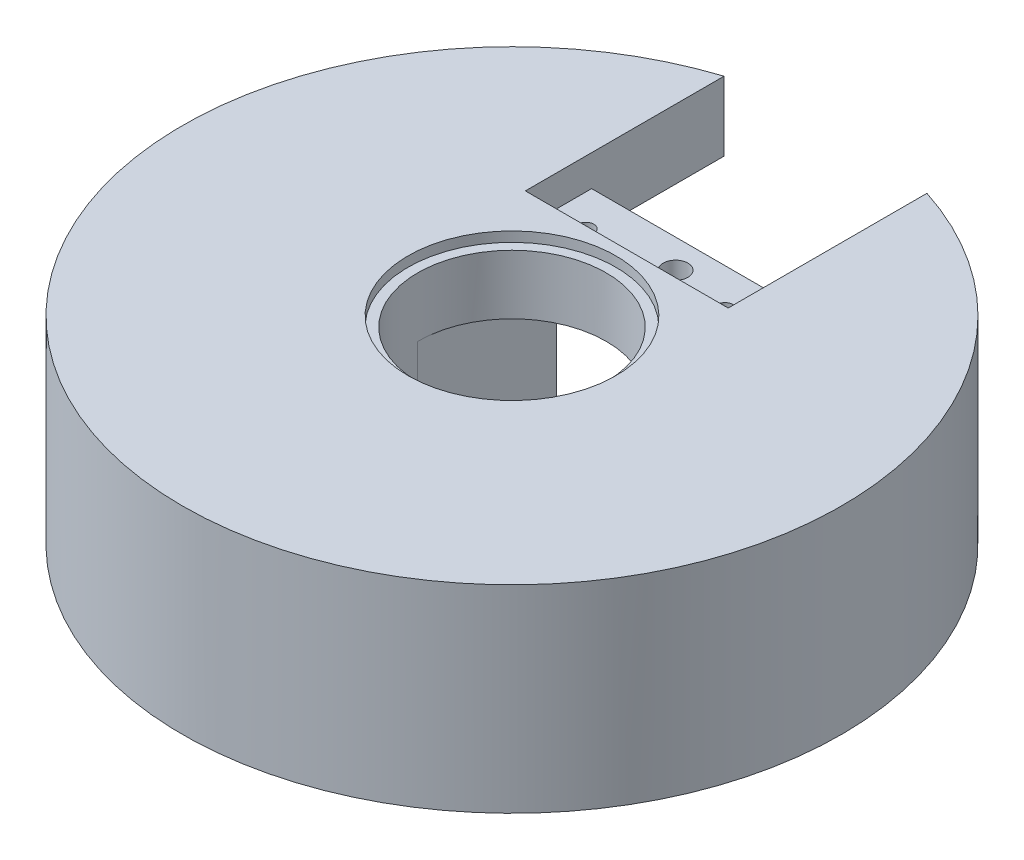
ISO-10303-21;
HEADER;
FILE_DESCRIPTION(('STEP AP214'),'2;1');
FILE_NAME('part.step','',(''),(''),'','','');
FILE_SCHEMA(('AUTOMOTIVE_DESIGN { 1 0 10303 214 1 1 1 1 }'));
ENDSEC;
DATA;
#1=APPLICATION_CONTEXT('core data for automotive mechanical design processes');
#2=APPLICATION_PROTOCOL_DEFINITION('international standard','automotive_design',2000,#1);
#3=PRODUCT_CONTEXT('',#1,'mechanical');
#4=PRODUCT('Part','Part','',(#3));
#5=PRODUCT_RELATED_PRODUCT_CATEGORY('part','',(#4));
#6=PRODUCT_DEFINITION_FORMATION('','',#4);
#7=PRODUCT_DEFINITION_CONTEXT('part definition',#1,'design');
#8=PRODUCT_DEFINITION('design','',#6,#7);
#9=PRODUCT_DEFINITION_SHAPE('','',#8);
#10=(LENGTH_UNIT() NAMED_UNIT(*) SI_UNIT(.MILLI.,.METRE.));
#11=(NAMED_UNIT(*) PLANE_ANGLE_UNIT() SI_UNIT($,.RADIAN.));
#12=(NAMED_UNIT(*) SI_UNIT($,.STERADIAN.) SOLID_ANGLE_UNIT());
#13=UNCERTAINTY_MEASURE_WITH_UNIT(LENGTH_MEASURE(1.E-05),#10,'distance_accuracy_value','');
#14=(GEOMETRIC_REPRESENTATION_CONTEXT(3) GLOBAL_UNCERTAINTY_ASSIGNED_CONTEXT((#13)) GLOBAL_UNIT_ASSIGNED_CONTEXT((#10,
#11,#12)) REPRESENTATION_CONTEXT('',''));
#15=CARTESIAN_POINT('',(0.,0.,0.));
#16=DIRECTION('',(0.,0.,1.));
#17=DIRECTION('',(1.,0.,0.));
#18=AXIS2_PLACEMENT_3D('',#15,#16,#17);
#19=CARTESIAN_POINT('',(0.,13.,0.));
#20=DIRECTION('',(0.,-1.,0.));
#21=DIRECTION('',(0.,0.,-1.));
#22=AXIS2_PLACEMENT_3D('',#19,#20,#21);
#23=CYLINDRICAL_SURFACE('',#22,9.525);
#24=CARTESIAN_POINT('',(0.,0.,0.));
#25=DIRECTION('',(0.,-1.,0.));
#26=DIRECTION('',(0.,0.,-1.));
#27=AXIS2_PLACEMENT_3D('',#24,#25,#26);
#28=CIRCLE('',#27,9.525);
#29=CARTESIAN_POINT('',(9.525,0.,0.));
#30=VERTEX_POINT('',#29);
#31=CARTESIAN_POINT('',(-9.525,0.,0.));
#32=VERTEX_POINT('',#31);
#33=EDGE_CURVE('E183',#30,#32,#28,.T.);
#34=ORIENTED_EDGE('',*,*,#33,.T.);
#35=DIRECTION('',(0.,-1.,0.));
#36=VECTOR('',#35,1.);
#37=CARTESIAN_POINT('',(-9.525,13.,0.));
#38=LINE('',#37,#36);
#39=CARTESIAN_POINT('',(-9.525,13.,0.));
#40=VERTEX_POINT('',#39);
#41=EDGE_CURVE('E214',#40,#32,#38,.T.);
#42=ORIENTED_EDGE('',*,*,#41,.F.);
#43=CARTESIAN_POINT('',(0.,13.,0.));
#44=DIRECTION('',(0.,-1.,0.));
#45=DIRECTION('',(0.,0.,-1.));
#46=AXIS2_PLACEMENT_3D('',#43,#44,#45);
#47=CIRCLE('',#46,9.525);
#48=CARTESIAN_POINT('',(9.525,13.,0.));
#49=VERTEX_POINT('',#48);
#50=EDGE_CURVE('E11',#40,#49,#47,.T.);
#51=ORIENTED_EDGE('',*,*,#50,.T.);
#52=DIRECTION('',(0.,-1.,0.));
#53=VECTOR('',#52,1.);
#54=CARTESIAN_POINT('',(9.525,13.,0.));
#55=LINE('',#54,#53);
#56=EDGE_CURVE('E174',#49,#30,#55,.T.);
#57=ORIENTED_EDGE('',*,*,#56,.T.);
#58=EDGE_LOOP('',(#34,#42,#51,#57));
#59=FACE_BOUND('',#58,.T.);
#60=CARTESIAN_POINT('',(0.,19.,0.));
#61=DIRECTION('',(0.,1.,0.));
#62=DIRECTION('',(0.,0.,1.));
#63=AXIS2_PLACEMENT_3D('',#60,#61,#62);
#64=CIRCLE('',#63,9.525);
#65=CARTESIAN_POINT('',(0.,19.,9.525));
#66=VERTEX_POINT('',#65);
#67=EDGE_CURVE('E253',#66,#66,#64,.T.);
#68=ORIENTED_EDGE('',*,*,#67,.T.);
#69=EDGE_LOOP('',(#68));
#70=FACE_BOUND('',#69,.T.);
#71=ADVANCED_FACE('F47',(#59,#70),#23,.F.);
#72=CARTESIAN_POINT('',(0.,20.,0.));
#73=DIRECTION('',(0.,-1.,0.));
#74=DIRECTION('',(0.,0.,-1.));
#75=AXIS2_PLACEMENT_3D('',#72,#73,#74);
#76=CYLINDRICAL_SURFACE('',#75,33.3);
#77=CARTESIAN_POINT('',(0.,13.,0.));
#78=DIRECTION('',(0.,-1.,0.));
#79=DIRECTION('',(0.,0.,-1.));
#80=AXIS2_PLACEMENT_3D('',#77,#78,#79);
#81=CIRCLE('',#80,33.3);
#82=CARTESIAN_POINT('',(10.25,13.,-31.6832368927166));
#83=VERTEX_POINT('',#82);
#84=CARTESIAN_POINT('',(21.202606521729,13.,-25.6776065217289));
#85=VERTEX_POINT('',#84);
#86=EDGE_CURVE('E168',#83,#85,#81,.T.);
#87=ORIENTED_EDGE('',*,*,#86,.F.);
#88=DIRECTION('',(0.,-1.,0.));
#89=VECTOR('',#88,1.);
#90=CARTESIAN_POINT('',(10.25,20.,-31.6832368927166));
#91=LINE('',#90,#89);
#92=CARTESIAN_POINT('',(10.25,20.,-31.6832368927166));
#93=VERTEX_POINT('',#92);
#94=EDGE_CURVE('E146',#83,#93,#91,.F.);
#95=ORIENTED_EDGE('',*,*,#94,.T.);
#96=CARTESIAN_POINT('',(0.,20.,0.));
#97=DIRECTION('',(0.,1.,0.));
#98=DIRECTION('',(0.,0.,1.));
#99=AXIS2_PLACEMENT_3D('',#96,#97,#98);
#100=CIRCLE('',#99,33.3);
#101=CARTESIAN_POINT('',(-10.25,20.,-31.6832368927166));
#102=VERTEX_POINT('',#101);
#103=EDGE_CURVE('E57',#102,#93,#100,.T.);
#104=ORIENTED_EDGE('',*,*,#103,.F.);
#105=DIRECTION('',(0.,-1.,0.));
#106=VECTOR('',#105,1.);
#107=CARTESIAN_POINT('',(-10.25,20.,-31.6832368927166));
#108=LINE('',#107,#106);
#109=CARTESIAN_POINT('',(-10.25,13.,-31.6832368927166));
#110=VERTEX_POINT('',#109);
#111=EDGE_CURVE('E73',#102,#110,#108,.T.);
#112=ORIENTED_EDGE('',*,*,#111,.T.);
#113=CARTESIAN_POINT('',(-21.202606521729,13.,-25.6776065217289));
#114=VERTEX_POINT('',#113);
#115=EDGE_CURVE('E142',#114,#110,#81,.T.);
#116=ORIENTED_EDGE('',*,*,#115,.F.);
#117=DIRECTION('',(0.,-1.,0.));
#118=VECTOR('',#117,1.);
#119=CARTESIAN_POINT('',(-21.202606521729,13.,-25.6776065217289));
#120=LINE('',#119,#118);
#121=CARTESIAN_POINT('',(-21.202606521729,0.,-25.6776065217289));
#122=VERTEX_POINT('',#121);
#123=EDGE_CURVE('E208',#114,#122,#120,.T.);
#124=ORIENTED_EDGE('',*,*,#123,.T.);
#125=CARTESIAN_POINT('',(0.,0.,0.));
#126=DIRECTION('',(0.,1.,0.));
#127=DIRECTION('',(0.,0.,1.));
#128=AXIS2_PLACEMENT_3D('',#125,#126,#127);
#129=CIRCLE('',#128,33.3);
#130=CARTESIAN_POINT('',(21.202606521729,0.,-25.6776065217289));
#131=VERTEX_POINT('',#130);
#132=EDGE_CURVE('E222',#122,#131,#129,.T.);
#133=ORIENTED_EDGE('',*,*,#132,.T.);
#134=DIRECTION('',(0.,-1.,0.));
#135=VECTOR('',#134,1.);
#136=CARTESIAN_POINT('',(21.202606521729,13.,-25.6776065217289));
#137=LINE('',#136,#135);
#138=EDGE_CURVE('E205',#85,#131,#137,.T.);
#139=ORIENTED_EDGE('',*,*,#138,.F.);
#140=EDGE_LOOP('',(#87,#95,#104,#112,#116,#124,#133,#139));
#141=FACE_BOUND('',#140,.T.);
#142=ADVANCED_FACE('F49',(#141),#76,.T.);
#143=CARTESIAN_POINT('',(0.,0.,0.));
#144=DIRECTION('',(0.,1.,0.));
#145=DIRECTION('',(0.,0.,1.));
#146=AXIS2_PLACEMENT_3D('',#143,#144,#145);
#147=PLANE('',#146);
#148=CARTESIAN_POINT('',(0.,0.,18.));
#149=DIRECTION('',(0.,1.,0.));
#150=DIRECTION('',(0.,0.,1.));
#151=AXIS2_PLACEMENT_3D('',#148,#149,#150);
#152=CIRCLE('',#151,2.5019);
#153=CARTESIAN_POINT('',(0.,0.,20.5019));
#154=VERTEX_POINT('',#153);
#155=EDGE_CURVE('E226',#154,#154,#152,.F.);
#156=ORIENTED_EDGE('',*,*,#155,.F.);
#157=EDGE_LOOP('',(#156));
#158=FACE_BOUND('',#157,.T.);
#159=CARTESIAN_POINT('',(15.5884572681199,0.,-9.00000000000007));
#160=DIRECTION('',(0.,1.,0.));
#161=DIRECTION('',(0.,0.,1.));
#162=AXIS2_PLACEMENT_3D('',#159,#160,#161);
#163=CIRCLE('',#162,2.5019);
#164=CARTESIAN_POINT('',(15.5884572681199,0.,-6.49810000000007));
#165=VERTEX_POINT('',#164);
#166=EDGE_CURVE('E230',#165,#165,#163,.F.);
#167=ORIENTED_EDGE('',*,*,#166,.F.);
#168=EDGE_LOOP('',(#167));
#169=FACE_BOUND('',#168,.T.);
#170=CARTESIAN_POINT('',(-15.58845726812,0.,-8.99999999999985));
#171=DIRECTION('',(0.,1.,0.));
#172=DIRECTION('',(0.,0.,1.));
#173=AXIS2_PLACEMENT_3D('',#170,#171,#172);
#174=CIRCLE('',#173,2.5019);
#175=CARTESIAN_POINT('',(-15.58845726812,0.,-6.49809999999985));
#176=VERTEX_POINT('',#175);
#177=EDGE_CURVE('E204',#176,#176,#174,.F.);
#178=ORIENTED_EDGE('',*,*,#177,.F.);
#179=EDGE_LOOP('',(#178));
#180=FACE_BOUND('',#179,.T.);
#181=DIRECTION('',(0.707106781186549,0.,-0.707106781186546));
#182=VECTOR('',#181,1.);
#183=CARTESIAN_POINT('',(-2.23750000000002,0.,-2.23750000000002));
#184=LINE('',#183,#182);
#185=CARTESIAN_POINT('',(9.525,0.,-14.));
#186=VERTEX_POINT('',#185);
#187=EDGE_CURVE('E195',#186,#131,#184,.T.);
#188=ORIENTED_EDGE('',*,*,#187,.T.);
#189=ORIENTED_EDGE('',*,*,#132,.F.);
#190=DIRECTION('',(-0.707106781186549,0.,-0.707106781186546));
#191=VECTOR('',#190,1.);
#192=CARTESIAN_POINT('',(2.23750000000002,0.,-2.23750000000002));
#193=LINE('',#192,#191);
#194=CARTESIAN_POINT('',(-9.525,0.,-14.));
#195=VERTEX_POINT('',#194);
#196=EDGE_CURVE('E192',#195,#122,#193,.T.);
#197=ORIENTED_EDGE('',*,*,#196,.F.);
#198=DIRECTION('',(0.,0.,-1.));
#199=VECTOR('',#198,1.);
#200=CARTESIAN_POINT('',(-9.525,0.,0.));
#201=LINE('',#200,#199);
#202=EDGE_CURVE('E188',#32,#195,#201,.T.);
#203=ORIENTED_EDGE('',*,*,#202,.F.);
#204=ORIENTED_EDGE('',*,*,#33,.F.);
#205=DIRECTION('',(0.,0.,-1.));
#206=VECTOR('',#205,1.);
#207=CARTESIAN_POINT('',(9.525,0.,0.));
#208=LINE('',#207,#206);
#209=EDGE_CURVE('E179',#30,#186,#208,.T.);
#210=ORIENTED_EDGE('',*,*,#209,.T.);
#211=EDGE_LOOP('',(#188,#189,#197,#203,#204,#210));
#212=FACE_BOUND('',#211,.T.);
#213=ADVANCED_FACE('F453',(#158,#169,#180,#212),#147,.F.);
#214=CARTESIAN_POINT('',(0.,20.,0.));
#215=DIRECTION('',(0.,1.,0.));
#216=DIRECTION('',(0.,0.,1.));
#217=AXIS2_PLACEMENT_3D('',#214,#215,#216);
#218=PLANE('',#217);
#219=DIRECTION('',(0.,0.,-1.));
#220=VECTOR('',#219,1.);
#221=CARTESIAN_POINT('',(10.25,20.,-11.6));
#222=LINE('',#221,#220);
#223=CARTESIAN_POINT('',(10.25,20.,-11.6));
#224=VERTEX_POINT('',#223);
#225=EDGE_CURVE('E156',#224,#93,#222,.T.);
#226=ORIENTED_EDGE('',*,*,#225,.F.);
#227=DIRECTION('',(1.,0.,0.));
#228=VECTOR('',#227,1.);
#229=CARTESIAN_POINT('',(-10.25,20.,-11.6));
#230=LINE('',#229,#228);
#231=CARTESIAN_POINT('',(-10.25,20.,-11.6));
#232=VERTEX_POINT('',#231);
#233=EDGE_CURVE('E375',#232,#224,#230,.T.);
#234=ORIENTED_EDGE('',*,*,#233,.F.);
#235=DIRECTION('',(0.,0.,1.));
#236=VECTOR('',#235,1.);
#237=CARTESIAN_POINT('',(-10.25,20.,-11.6));
#238=LINE('',#237,#236);
#239=EDGE_CURVE('E381',#102,#232,#238,.T.);
#240=ORIENTED_EDGE('',*,*,#239,.F.);
#241=ORIENTED_EDGE('',*,*,#103,.T.);
#242=EDGE_LOOP('',(#226,#234,#240,#241));
#243=FACE_BOUND('',#242,.T.);
#244=CARTESIAN_POINT('',(0.,20.,0.));
#245=DIRECTION('',(0.,1.,0.));
#246=DIRECTION('',(0.,0.,1.));
#247=AXIS2_PLACEMENT_3D('',#244,#245,#246);
#248=CIRCLE('',#247,10.5);
#249=CARTESIAN_POINT('',(0.,20.,10.5));
#250=VERTEX_POINT('',#249);
#251=EDGE_CURVE('E247',#250,#250,#248,.T.);
#252=ORIENTED_EDGE('',*,*,#251,.F.);
#253=EDGE_LOOP('',(#252));
#254=FACE_BOUND('',#253,.T.);
#255=ADVANCED_FACE('F423',(#243,#254),#218,.T.);
#256=CARTESIAN_POINT('',(0.,0.,18.));
#257=DIRECTION('',(1.,0.,0.));
#258=DIRECTION('',(0.,0.,-1.));
#259=AXIS2_PLACEMENT_3D('',#256,#257,#258);
#260=SPHERICAL_SURFACE('',#259,2.5019);
#261=CARTESIAN_POINT('',(0.,0.,18.));
#262=DIRECTION('',(0.,1.,0.));
#263=DIRECTION('',(0.,0.,1.));
#264=AXIS2_PLACEMENT_3D('',#261,#262,#263);
#265=SPHERICAL_SURFACE('',#264,2.5019);
#266=ORIENTED_EDGE('',*,*,#155,.T.);
#267=EDGE_LOOP('',(#266));
#268=FACE_BOUND('',#267,.T.);
#269=ADVANCED_FACE('F471',(#268),#265,.F.);
#270=CARTESIAN_POINT('',(15.5884572681199,0.,-9.00000000000007));
#271=DIRECTION('',(-0.500000000000004,0.,-0.866025403784436));
#272=DIRECTION('',(-0.866025403784436,0.,0.500000000000004));
#273=AXIS2_PLACEMENT_3D('',#270,#271,#272);
#274=SPHERICAL_SURFACE('',#273,2.5019);
#275=CARTESIAN_POINT('',(15.5884572681199,0.,-9.00000000000007));
#276=DIRECTION('',(0.,1.,0.));
#277=DIRECTION('',(0.,0.,1.));
#278=AXIS2_PLACEMENT_3D('',#275,#276,#277);
#279=SPHERICAL_SURFACE('',#278,2.5019);
#280=ORIENTED_EDGE('',*,*,#166,.T.);
#281=EDGE_LOOP('',(#280));
#282=FACE_BOUND('',#281,.T.);
#283=ADVANCED_FACE('F467',(#282),#279,.F.);
#284=CARTESIAN_POINT('',(-15.58845726812,0.,-8.99999999999985));
#285=DIRECTION('',(-0.499999999999992,0.,0.866025403784443));
#286=DIRECTION('',(0.866025403784443,0.,0.499999999999992));
#287=AXIS2_PLACEMENT_3D('',#284,#285,#286);
#288=SPHERICAL_SURFACE('',#287,2.5019);
#289=CARTESIAN_POINT('',(-15.58845726812,0.,-8.99999999999985));
#290=DIRECTION('',(0.,1.,0.));
#291=DIRECTION('',(0.,0.,1.));
#292=AXIS2_PLACEMENT_3D('',#289,#290,#291);
#293=SPHERICAL_SURFACE('',#292,2.5019);
#294=ORIENTED_EDGE('',*,*,#177,.T.);
#295=EDGE_LOOP('',(#294));
#296=FACE_BOUND('',#295,.T.);
#297=ADVANCED_FACE('F463',(#296),#293,.F.);
#298=CARTESIAN_POINT('',(9.525,13.,0.));
#299=DIRECTION('',(-1.,0.,0.));
#300=DIRECTION('',(0.,0.,1.));
#301=AXIS2_PLACEMENT_3D('',#298,#299,#300);
#302=PLANE('',#301);
#303=ORIENTED_EDGE('',*,*,#209,.F.);
#304=ORIENTED_EDGE('',*,*,#56,.F.);
#305=DIRECTION('',(0.,0.,-1.));
#306=VECTOR('',#305,1.);
#307=CARTESIAN_POINT('',(9.525,13.,0.));
#308=LINE('',#307,#306);
#309=CARTESIAN_POINT('',(9.525,13.,-14.));
#310=VERTEX_POINT('',#309);
#311=EDGE_CURVE('E199',#49,#310,#308,.T.);
#312=ORIENTED_EDGE('',*,*,#311,.T.);
#313=DIRECTION('',(0.,-1.,0.));
#314=VECTOR('',#313,1.);
#315=CARTESIAN_POINT('',(9.525,13.,-14.));
#316=LINE('',#315,#314);
#317=EDGE_CURVE('E200',#310,#186,#316,.T.);
#318=ORIENTED_EDGE('',*,*,#317,.T.);
#319=EDGE_LOOP('',(#303,#304,#312,#318));
#320=FACE_BOUND('',#319,.T.);
#321=ADVANCED_FACE('F459',(#320),#302,.T.);
#322=CARTESIAN_POINT('',(-2.23750000000002,13.,-2.23750000000002));
#323=DIRECTION('',(-0.707106781186546,0.,-0.707106781186548));
#324=DIRECTION('',(-0.707106781186549,0.,0.707106781186547));
#325=AXIS2_PLACEMENT_3D('',#322,#323,#324);
#326=PLANE('',#325);
#327=ORIENTED_EDGE('',*,*,#187,.F.);
#328=ORIENTED_EDGE('',*,*,#317,.F.);
#329=DIRECTION('',(0.707106781186549,0.,-0.707106781186546));
#330=VECTOR('',#329,1.);
#331=CARTESIAN_POINT('',(-2.23750000000002,13.,-2.23750000000002));
#332=LINE('',#331,#330);
#333=EDGE_CURVE('E167',#310,#85,#332,.T.);
#334=ORIENTED_EDGE('',*,*,#333,.T.);
#335=ORIENTED_EDGE('',*,*,#138,.T.);
#336=EDGE_LOOP('',(#327,#328,#334,#335));
#337=FACE_BOUND('',#336,.T.);
#338=ADVANCED_FACE('F462',(#337),#326,.T.);
#339=CARTESIAN_POINT('',(2.23750000000002,13.,-2.23750000000002));
#340=DIRECTION('',(-0.707106781186546,0.,0.707106781186548));
#341=DIRECTION('',(0.707106781186549,0.,0.707106781186547));
#342=AXIS2_PLACEMENT_3D('',#339,#340,#341);
#343=PLANE('',#342);
#344=ORIENTED_EDGE('',*,*,#196,.T.);
#345=ORIENTED_EDGE('',*,*,#123,.F.);
#346=DIRECTION('',(-0.707106781186549,0.,-0.707106781186546));
#347=VECTOR('',#346,1.);
#348=CARTESIAN_POINT('',(2.23750000000002,13.,-2.23750000000002));
#349=LINE('',#348,#347);
#350=CARTESIAN_POINT('',(-9.525,13.,-14.));
#351=VERTEX_POINT('',#350);
#352=EDGE_CURVE('E165',#351,#114,#349,.T.);
#353=ORIENTED_EDGE('',*,*,#352,.F.);
#354=DIRECTION('',(0.,-1.,0.));
#355=VECTOR('',#354,1.);
#356=CARTESIAN_POINT('',(-9.525,13.,-14.));
#357=LINE('',#356,#355);
#358=EDGE_CURVE('E211',#351,#195,#357,.T.);
#359=ORIENTED_EDGE('',*,*,#358,.T.);
#360=EDGE_LOOP('',(#344,#345,#353,#359));
#361=FACE_BOUND('',#360,.T.);
#362=ADVANCED_FACE('F494',(#361),#343,.F.);
#363=CARTESIAN_POINT('',(-9.525,13.,0.));
#364=DIRECTION('',(-1.,0.,0.));
#365=DIRECTION('',(0.,0.,1.));
#366=AXIS2_PLACEMENT_3D('',#363,#364,#365);
#367=PLANE('',#366);
#368=ORIENTED_EDGE('',*,*,#202,.T.);
#369=ORIENTED_EDGE('',*,*,#358,.F.);
#370=DIRECTION('',(0.,0.,-1.));
#371=VECTOR('',#370,1.);
#372=CARTESIAN_POINT('',(-9.525,13.,0.));
#373=LINE('',#372,#371);
#374=EDGE_CURVE('E265',#40,#351,#373,.T.);
#375=ORIENTED_EDGE('',*,*,#374,.F.);
#376=ORIENTED_EDGE('',*,*,#41,.T.);
#377=EDGE_LOOP('',(#368,#369,#375,#376));
#378=FACE_BOUND('',#377,.T.);
#379=ADVANCED_FACE('F457',(#378),#367,.F.);
#380=CARTESIAN_POINT('',(0.,13.,0.));
#381=DIRECTION('',(0.,-1.,0.));
#382=DIRECTION('',(0.,0.,-1.));
#383=AXIS2_PLACEMENT_3D('',#380,#381,#382);
#384=PLANE('',#383);
#385=DIRECTION('',(0.,0.,-1.));
#386=VECTOR('',#385,1.);
#387=CARTESIAN_POINT('',(10.25,13.,-18.3));
#388=LINE('',#387,#386);
#389=CARTESIAN_POINT('',(10.25,13.,-18.3));
#390=VERTEX_POINT('',#389);
#391=EDGE_CURVE('E405',#390,#83,#388,.T.);
#392=ORIENTED_EDGE('',*,*,#391,.T.);
#393=ORIENTED_EDGE('',*,*,#86,.T.);
#394=ORIENTED_EDGE('',*,*,#333,.F.);
#395=ORIENTED_EDGE('',*,*,#311,.F.);
#396=ORIENTED_EDGE('',*,*,#50,.F.);
#397=ORIENTED_EDGE('',*,*,#374,.T.);
#398=ORIENTED_EDGE('',*,*,#352,.T.);
#399=ORIENTED_EDGE('',*,*,#115,.T.);
#400=DIRECTION('',(0.,0.,1.));
#401=VECTOR('',#400,1.);
#402=CARTESIAN_POINT('',(-10.25,13.,-18.3));
#403=LINE('',#402,#401);
#404=CARTESIAN_POINT('',(-10.25,13.,-18.3));
#405=VERTEX_POINT('',#404);
#406=EDGE_CURVE('E150',#110,#405,#403,.T.);
#407=ORIENTED_EDGE('',*,*,#406,.T.);
#408=DIRECTION('',(1.,0.,0.));
#409=VECTOR('',#408,1.);
#410=CARTESIAN_POINT('',(-10.25,13.,-18.3));
#411=LINE('',#410,#409);
#412=EDGE_CURVE('E410',#405,#390,#411,.T.);
#413=ORIENTED_EDGE('',*,*,#412,.T.);
#414=EDGE_LOOP('',(#392,#393,#394,#395,#396,#397,#398,#399,#407,#413));
#415=FACE_BOUND('',#414,.T.);
#416=CARTESIAN_POINT('',(-7.03,13.,-14.5));
#417=DIRECTION('',(0.,-1.,0.));
#418=DIRECTION('',(0.,0.,-1.));
#419=AXIS2_PLACEMENT_3D('',#416,#417,#418);
#420=CIRCLE('',#419,0.8);
#421=CARTESIAN_POINT('',(-7.03,13.,-15.3));
#422=VERTEX_POINT('',#421);
#423=EDGE_CURVE('E244',#422,#422,#420,.T.);
#424=ORIENTED_EDGE('',*,*,#423,.F.);
#425=EDGE_LOOP('',(#424));
#426=FACE_BOUND('',#425,.T.);
#427=CARTESIAN_POINT('',(7.03,13.,-14.5));
#428=DIRECTION('',(0.,-1.,0.));
#429=DIRECTION('',(0.,0.,-1.));
#430=AXIS2_PLACEMENT_3D('',#427,#428,#429);
#431=CIRCLE('',#430,0.8);
#432=CARTESIAN_POINT('',(7.03,13.,-15.3));
#433=VERTEX_POINT('',#432);
#434=EDGE_CURVE('E241',#433,#433,#431,.T.);
#435=ORIENTED_EDGE('',*,*,#434,.F.);
#436=EDGE_LOOP('',(#435));
#437=FACE_BOUND('',#436,.T.);
#438=CARTESIAN_POINT('',(1.13,13.,-15.4));
#439=DIRECTION('',(0.,-1.,0.));
#440=DIRECTION('',(0.,0.,-1.));
#441=AXIS2_PLACEMENT_3D('',#438,#439,#440);
#442=CIRCLE('',#441,1.25);
#443=CARTESIAN_POINT('',(1.13,13.,-16.65));
#444=VERTEX_POINT('',#443);
#445=EDGE_CURVE('E237',#444,#444,#442,.T.);
#446=ORIENTED_EDGE('',*,*,#445,.F.);
#447=EDGE_LOOP('',(#446));
#448=FACE_BOUND('',#447,.T.);
#449=ADVANCED_FACE('F161',(#415,#426,#437,#448),#384,.T.);
#450=CARTESIAN_POINT('',(0.,19.,0.));
#451=DIRECTION('',(0.,1.,0.));
#452=DIRECTION('',(0.,0.,1.));
#453=AXIS2_PLACEMENT_3D('',#450,#451,#452);
#454=CYLINDRICAL_SURFACE('',#453,10.5);
#455=CARTESIAN_POINT('',(0.,19.,0.));
#456=DIRECTION('',(0.,1.,0.));
#457=DIRECTION('',(0.,0.,1.));
#458=AXIS2_PLACEMENT_3D('',#455,#456,#457);
#459=CIRCLE('',#458,10.5);
#460=CARTESIAN_POINT('',(0.,19.,10.5));
#461=VERTEX_POINT('',#460);
#462=EDGE_CURVE('E184',#461,#461,#459,.T.);
#463=ORIENTED_EDGE('',*,*,#462,.F.);
#464=EDGE_LOOP('',(#463));
#465=FACE_BOUND('',#464,.T.);
#466=ORIENTED_EDGE('',*,*,#251,.T.);
#467=EDGE_LOOP('',(#466));
#468=FACE_BOUND('',#467,.T.);
#469=ADVANCED_FACE('F507',(#465,#468),#454,.F.);
#470=CARTESIAN_POINT('',(0.,19.,0.));
#471=DIRECTION('',(0.,1.,0.));
#472=DIRECTION('',(0.,0.,1.));
#473=AXIS2_PLACEMENT_3D('',#470,#471,#472);
#474=PLANE('',#473);
#475=ORIENTED_EDGE('',*,*,#67,.F.);
#476=EDGE_LOOP('',(#475));
#477=FACE_BOUND('',#476,.T.);
#478=ORIENTED_EDGE('',*,*,#462,.T.);
#479=EDGE_LOOP('',(#478));
#480=FACE_BOUND('',#479,.T.);
#481=ADVANCED_FACE('F509',(#477,#480),#474,.T.);
#482=CARTESIAN_POINT('',(1.13,0.,-15.4));
#483=DIRECTION('',(0.,1.,0.));
#484=DIRECTION('',(0.,0.,1.));
#485=AXIS2_PLACEMENT_3D('',#482,#483,#484);
#486=CYLINDRICAL_SURFACE('',#485,1.25);
#487=CARTESIAN_POINT('',(1.13,16.85,-15.4));
#488=DIRECTION('',(0.,-1.,0.));
#489=DIRECTION('',(0.,0.,-1.));
#490=AXIS2_PLACEMENT_3D('',#487,#488,#489);
#491=CIRCLE('',#490,1.25);
#492=CARTESIAN_POINT('',(1.13,16.85,-16.65));
#493=VERTEX_POINT('',#492);
#494=EDGE_CURVE('E147',#493,#493,#491,.F.);
#495=ORIENTED_EDGE('',*,*,#494,.T.);
#496=EDGE_LOOP('',(#495));
#497=FACE_BOUND('',#496,.T.);
#498=ORIENTED_EDGE('',*,*,#445,.T.);
#499=EDGE_LOOP('',(#498));
#500=FACE_BOUND('',#499,.T.);
#501=ADVANCED_FACE('F513',(#497,#500),#486,.F.);
#502=CARTESIAN_POINT('',(7.03,0.,-14.5));
#503=DIRECTION('',(0.,1.,0.));
#504=DIRECTION('',(0.,0.,1.));
#505=AXIS2_PLACEMENT_3D('',#502,#503,#504);
#506=CYLINDRICAL_SURFACE('',#505,0.8);
#507=CARTESIAN_POINT('',(7.03,16.85,-14.5));
#508=DIRECTION('',(0.,-1.,0.));
#509=DIRECTION('',(0.,0.,-1.));
#510=AXIS2_PLACEMENT_3D('',#507,#508,#509);
#511=CIRCLE('',#510,0.8);
#512=CARTESIAN_POINT('',(7.03,16.85,-15.3));
#513=VERTEX_POINT('',#512);
#514=EDGE_CURVE('E337',#513,#513,#511,.F.);
#515=ORIENTED_EDGE('',*,*,#514,.T.);
#516=EDGE_LOOP('',(#515));
#517=FACE_BOUND('',#516,.T.);
#518=ORIENTED_EDGE('',*,*,#434,.T.);
#519=EDGE_LOOP('',(#518));
#520=FACE_BOUND('',#519,.T.);
#521=ADVANCED_FACE('F517',(#517,#520),#506,.F.);
#522=CARTESIAN_POINT('',(-7.03,0.,-14.5));
#523=DIRECTION('',(0.,1.,0.));
#524=DIRECTION('',(0.,0.,1.));
#525=AXIS2_PLACEMENT_3D('',#522,#523,#524);
#526=CYLINDRICAL_SURFACE('',#525,0.8);
#527=CARTESIAN_POINT('',(-7.03,16.85,-14.5));
#528=DIRECTION('',(0.,-1.,0.));
#529=DIRECTION('',(0.,0.,-1.));
#530=AXIS2_PLACEMENT_3D('',#527,#528,#529);
#531=CIRCLE('',#530,0.8);
#532=CARTESIAN_POINT('',(-7.03,16.85,-15.3));
#533=VERTEX_POINT('',#532);
#534=EDGE_CURVE('E51',#533,#533,#531,.F.);
#535=ORIENTED_EDGE('',*,*,#534,.T.);
#536=EDGE_LOOP('',(#535));
#537=FACE_BOUND('',#536,.T.);
#538=ORIENTED_EDGE('',*,*,#423,.T.);
#539=EDGE_LOOP('',(#538));
#540=FACE_BOUND('',#539,.T.);
#541=ADVANCED_FACE('F521',(#537,#540),#526,.F.);
#542=CARTESIAN_POINT('',(10.25,16.85,-11.6));
#543=DIRECTION('',(1.,0.,0.));
#544=DIRECTION('',(0.,0.,-1.));
#545=AXIS2_PLACEMENT_3D('',#542,#543,#544);
#546=PLANE('',#545);
#547=DIRECTION('',(0.,0.,-1.));
#548=VECTOR('',#547,1.);
#549=CARTESIAN_POINT('',(10.25,16.85,-11.6));
#550=LINE('',#549,#548);
#551=CARTESIAN_POINT('',(10.25,16.85,-11.6));
#552=VERTEX_POINT('',#551);
#553=CARTESIAN_POINT('',(10.25,16.85,-18.3));
#554=VERTEX_POINT('',#553);
#555=EDGE_CURVE('E369',#552,#554,#550,.T.);
#556=ORIENTED_EDGE('',*,*,#555,.F.);
#557=DIRECTION('',(0.,1.,0.));
#558=VECTOR('',#557,1.);
#559=CARTESIAN_POINT('',(10.25,16.85,-11.6));
#560=LINE('',#559,#558);
#561=EDGE_CURVE('E348',#552,#224,#560,.T.);
#562=ORIENTED_EDGE('',*,*,#561,.T.);
#563=ORIENTED_EDGE('',*,*,#225,.T.);
#564=ORIENTED_EDGE('',*,*,#94,.F.);
#565=ORIENTED_EDGE('',*,*,#391,.F.);
#566=DIRECTION('',(0.,1.,0.));
#567=VECTOR('',#566,1.);
#568=CARTESIAN_POINT('',(10.25,-0.001000000000001,-18.3));
#569=LINE('',#568,#567);
#570=EDGE_CURVE('E157',#390,#554,#569,.T.);
#571=ORIENTED_EDGE('',*,*,#570,.T.);
#572=EDGE_LOOP('',(#556,#562,#563,#564,#565,#571));
#573=FACE_BOUND('',#572,.T.);
#574=ADVANCED_FACE('F419',(#573),#546,.F.);
#575=CARTESIAN_POINT('',(-10.25,16.85,-11.6));
#576=DIRECTION('',(-1.,0.,0.));
#577=DIRECTION('',(0.,0.,1.));
#578=AXIS2_PLACEMENT_3D('',#575,#576,#577);
#579=PLANE('',#578);
#580=ORIENTED_EDGE('',*,*,#239,.T.);
#581=DIRECTION('',(0.,1.,0.));
#582=VECTOR('',#581,1.);
#583=CARTESIAN_POINT('',(-10.25,16.85,-11.6));
#584=LINE('',#583,#582);
#585=CARTESIAN_POINT('',(-10.25,16.85,-11.6));
#586=VERTEX_POINT('',#585);
#587=EDGE_CURVE('E352',#586,#232,#584,.T.);
#588=ORIENTED_EDGE('',*,*,#587,.F.);
#589=DIRECTION('',(0.,0.,1.));
#590=VECTOR('',#589,1.);
#591=CARTESIAN_POINT('',(-10.25,16.85,-11.6));
#592=LINE('',#591,#590);
#593=CARTESIAN_POINT('',(-10.25,16.85,-18.3));
#594=VERTEX_POINT('',#593);
#595=EDGE_CURVE('E364',#594,#586,#592,.T.);
#596=ORIENTED_EDGE('',*,*,#595,.F.);
#597=DIRECTION('',(0.,1.,0.));
#598=VECTOR('',#597,1.);
#599=CARTESIAN_POINT('',(-10.25,-0.001000000000001,-18.3));
#600=LINE('',#599,#598);
#601=EDGE_CURVE('E65',#405,#594,#600,.T.);
#602=ORIENTED_EDGE('',*,*,#601,.F.);
#603=ORIENTED_EDGE('',*,*,#406,.F.);
#604=ORIENTED_EDGE('',*,*,#111,.F.);
#605=EDGE_LOOP('',(#580,#588,#596,#602,#603,#604));
#606=FACE_BOUND('',#605,.T.);
#607=ADVANCED_FACE('F151',(#606),#579,.F.);
#608=CARTESIAN_POINT('',(0.,16.85,0.));
#609=DIRECTION('',(0.,-1.,0.));
#610=DIRECTION('',(0.,0.,-1.));
#611=AXIS2_PLACEMENT_3D('',#608,#609,#610);
#612=PLANE('',#611);
#613=ORIENTED_EDGE('',*,*,#514,.F.);
#614=EDGE_LOOP('',(#613));
#615=FACE_BOUND('',#614,.T.);
#616=ORIENTED_EDGE('',*,*,#534,.F.);
#617=EDGE_LOOP('',(#616));
#618=FACE_BOUND('',#617,.T.);
#619=ORIENTED_EDGE('',*,*,#494,.F.);
#620=EDGE_LOOP('',(#619));
#621=FACE_BOUND('',#620,.T.);
#622=ORIENTED_EDGE('',*,*,#555,.T.);
#623=DIRECTION('',(1.,0.,0.));
#624=VECTOR('',#623,1.);
#625=CARTESIAN_POINT('',(-10.25,16.85,-18.3));
#626=LINE('',#625,#624);
#627=EDGE_CURVE('E400',#594,#554,#626,.T.);
#628=ORIENTED_EDGE('',*,*,#627,.F.);
#629=ORIENTED_EDGE('',*,*,#595,.T.);
#630=DIRECTION('',(1.,0.,0.));
#631=VECTOR('',#630,1.);
#632=CARTESIAN_POINT('',(-10.25,16.85,-11.6));
#633=LINE('',#632,#631);
#634=EDGE_CURVE('E358',#586,#552,#633,.T.);
#635=ORIENTED_EDGE('',*,*,#634,.T.);
#636=EDGE_LOOP('',(#622,#628,#629,#635));
#637=FACE_BOUND('',#636,.T.);
#638=ADVANCED_FACE('F431',(#615,#618,#621,#637),#612,.F.);
#639=CARTESIAN_POINT('',(-10.25,16.85,-11.6));
#640=DIRECTION('',(0.,0.,1.));
#641=DIRECTION('',(1.,0.,0.));
#642=AXIS2_PLACEMENT_3D('',#639,#640,#641);
#643=PLANE('',#642);
#644=ORIENTED_EDGE('',*,*,#233,.T.);
#645=ORIENTED_EDGE('',*,*,#561,.F.);
#646=ORIENTED_EDGE('',*,*,#634,.F.);
#647=ORIENTED_EDGE('',*,*,#587,.T.);
#648=EDGE_LOOP('',(#644,#645,#646,#647));
#649=FACE_BOUND('',#648,.T.);
#650=ADVANCED_FACE('F429',(#649),#643,.F.);
#651=CARTESIAN_POINT('',(-10.25,-0.001000000000001,-18.3));
#652=DIRECTION('',(0.,0.,1.));
#653=DIRECTION('',(1.,0.,0.));
#654=AXIS2_PLACEMENT_3D('',#651,#652,#653);
#655=PLANE('',#654);
#656=ORIENTED_EDGE('',*,*,#601,.T.);
#657=ORIENTED_EDGE('',*,*,#627,.T.);
#658=ORIENTED_EDGE('',*,*,#570,.F.);
#659=ORIENTED_EDGE('',*,*,#412,.F.);
#660=EDGE_LOOP('',(#656,#657,#658,#659));
#661=FACE_BOUND('',#660,.T.);
#662=ADVANCED_FACE('F416',(#661),#655,.F.);
#663=CLOSED_SHELL('',(#71,#142,#213,#255,#269,#283,#297,#321,#338,#362,#379,#449,#469,#481,#501,
#521,#541,#574,#607,#638,#650,#662));
#664=MANIFOLD_SOLID_BREP('B2',#663);
#665=ADVANCED_BREP_SHAPE_REPRESENTATION('',(#18,#664),#14);
#666=SHAPE_DEFINITION_REPRESENTATION(#9,#665);
ENDSEC;
END-ISO-10303-21;
